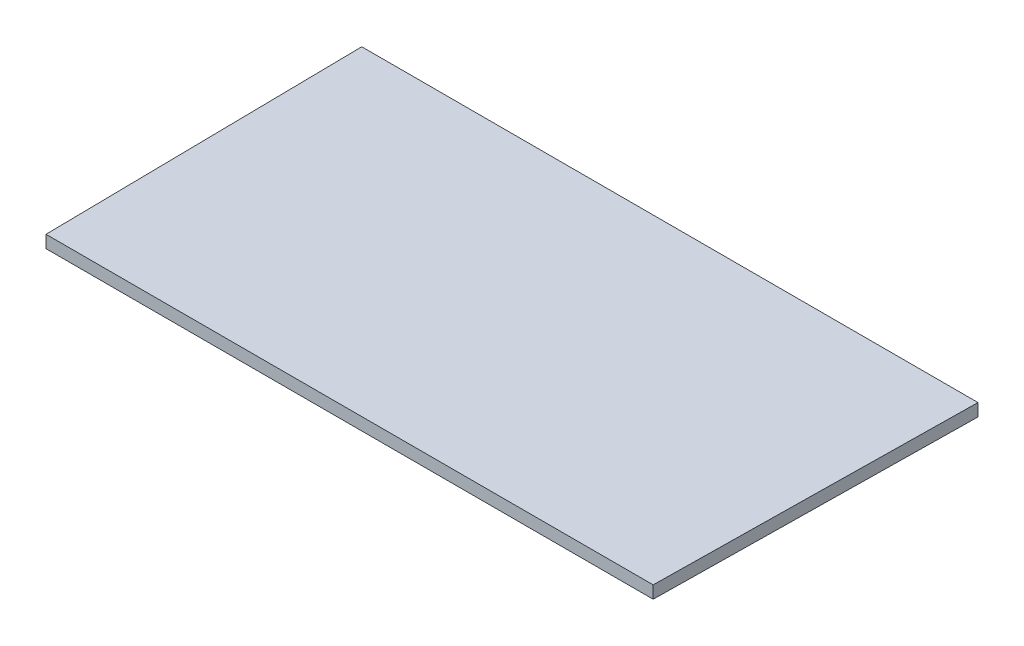
ISO-10303-21;
HEADER;
FILE_DESCRIPTION(('STEP AP214'),'2;1');
FILE_NAME('part.step','',(''),(''),'','','');
FILE_SCHEMA(('AUTOMOTIVE_DESIGN { 1 0 10303 214 1 1 1 1 }'));
ENDSEC;
DATA;
#1=APPLICATION_CONTEXT('core data for automotive mechanical design processes');
#2=APPLICATION_PROTOCOL_DEFINITION('international standard','automotive_design',2000,#1);
#3=PRODUCT_CONTEXT('',#1,'mechanical');
#4=PRODUCT('Part','Part','',(#3));
#5=PRODUCT_RELATED_PRODUCT_CATEGORY('part','',(#4));
#6=PRODUCT_DEFINITION_FORMATION('','',#4);
#7=PRODUCT_DEFINITION_CONTEXT('part definition',#1,'design');
#8=PRODUCT_DEFINITION('design','',#6,#7);
#9=PRODUCT_DEFINITION_SHAPE('','',#8);
#10=(LENGTH_UNIT() NAMED_UNIT(*) SI_UNIT(.MILLI.,.METRE.));
#11=(NAMED_UNIT(*) PLANE_ANGLE_UNIT() SI_UNIT($,.RADIAN.));
#12=(NAMED_UNIT(*) SI_UNIT($,.STERADIAN.) SOLID_ANGLE_UNIT());
#13=UNCERTAINTY_MEASURE_WITH_UNIT(LENGTH_MEASURE(1.E-05),#10,'distance_accuracy_value','');
#14=(GEOMETRIC_REPRESENTATION_CONTEXT(3) GLOBAL_UNCERTAINTY_ASSIGNED_CONTEXT((#13)) GLOBAL_UNIT_ASSIGNED_CONTEXT((#10,
#11,#12)) REPRESENTATION_CONTEXT('',''));
#15=CARTESIAN_POINT('',(0.,0.,0.));
#16=DIRECTION('',(0.,0.,1.));
#17=DIRECTION('',(1.,0.,0.));
#18=AXIS2_PLACEMENT_3D('',#15,#16,#17);
#19=CARTESIAN_POINT('',(74.075,3.,-77.));
#20=DIRECTION('',(-0.999900071919753,0.,-0.0141366960380366));
#21=DIRECTION('',(-0.0141366960380366,0.,0.999900071919754));
#22=AXIS2_PLACEMENT_3D('',#19,#20,#21);
#23=PLANE('',#22);
#24=DIRECTION('',(0.0141366960380366,0.,-0.999900071919753));
#25=VECTOR('',#24,1.);
#26=CARTESIAN_POINT('',(74.075,0.,-77.));
#27=LINE('',#26,#25);
#28=CARTESIAN_POINT('',(72.9863656199275,0.,0.));
#29=VERTEX_POINT('',#28);
#30=CARTESIAN_POINT('',(74.075,0.,-77.));
#31=VERTEX_POINT('',#30);
#32=EDGE_CURVE('E100',#29,#31,#27,.T.);
#33=ORIENTED_EDGE('',*,*,#32,.T.);
#34=DIRECTION('',(0.,-1.,0.));
#35=VECTOR('',#34,1.);
#36=CARTESIAN_POINT('',(74.075,3.,-77.));
#37=LINE('',#36,#35);
#38=CARTESIAN_POINT('',(74.075,3.,-77.));
#39=VERTEX_POINT('',#38);
#40=EDGE_CURVE('E11',#39,#31,#37,.T.);
#41=ORIENTED_EDGE('',*,*,#40,.F.);
#42=DIRECTION('',(0.0141366960380366,0.,-0.999900071919753));
#43=VECTOR('',#42,1.);
#44=CARTESIAN_POINT('',(74.075,3.,-77.));
#45=LINE('',#44,#43);
#46=CARTESIAN_POINT('',(72.9863656199275,3.,0.));
#47=VERTEX_POINT('',#46);
#48=EDGE_CURVE('E88',#47,#39,#45,.T.);
#49=ORIENTED_EDGE('',*,*,#48,.F.);
#50=DIRECTION('',(0.,-1.,0.));
#51=VECTOR('',#50,1.);
#52=CARTESIAN_POINT('',(72.9863656199275,3.,0.));
#53=LINE('',#52,#51);
#54=EDGE_CURVE('E96',#47,#29,#53,.T.);
#55=ORIENTED_EDGE('',*,*,#54,.T.);
#56=EDGE_LOOP('',(#33,#41,#49,#55));
#57=FACE_BOUND('',#56,.T.);
#58=ADVANCED_FACE('F37',(#57),#23,.F.);
#59=CARTESIAN_POINT('',(-74.075,3.,-77.));
#60=DIRECTION('',(0.,0.,1.));
#61=DIRECTION('',(1.,0.,0.));
#62=AXIS2_PLACEMENT_3D('',#59,#60,#61);
#63=PLANE('',#62);
#64=DIRECTION('',(-1.,0.,0.));
#65=VECTOR('',#64,1.);
#66=CARTESIAN_POINT('',(-74.075,0.,-77.));
#67=LINE('',#66,#65);
#68=CARTESIAN_POINT('',(-74.075,0.,-77.));
#69=VERTEX_POINT('',#68);
#70=EDGE_CURVE('E92',#31,#69,#67,.T.);
#71=ORIENTED_EDGE('',*,*,#70,.T.);
#72=DIRECTION('',(0.,-1.,0.));
#73=VECTOR('',#72,1.);
#74=CARTESIAN_POINT('',(-74.075,3.,-77.));
#75=LINE('',#74,#73);
#76=CARTESIAN_POINT('',(-74.075,3.,-77.));
#77=VERTEX_POINT('',#76);
#78=EDGE_CURVE('E45',#77,#69,#75,.T.);
#79=ORIENTED_EDGE('',*,*,#78,.F.);
#80=DIRECTION('',(-1.,0.,0.));
#81=VECTOR('',#80,1.);
#82=CARTESIAN_POINT('',(-74.075,3.,-77.));
#83=LINE('',#82,#81);
#84=EDGE_CURVE('E83',#39,#77,#83,.T.);
#85=ORIENTED_EDGE('',*,*,#84,.F.);
#86=ORIENTED_EDGE('',*,*,#40,.T.);
#87=EDGE_LOOP('',(#71,#79,#85,#86));
#88=FACE_BOUND('',#87,.T.);
#89=ADVANCED_FACE('F91',(#88),#63,.F.);
#90=CARTESIAN_POINT('',(-72.9863656199275,3.,0.));
#91=DIRECTION('',(0.999900071919754,0.,-0.0141366960380362));
#92=DIRECTION('',(-0.0141366960380362,0.,-0.999900071919754));
#93=AXIS2_PLACEMENT_3D('',#90,#91,#92);
#94=PLANE('',#93);
#95=DIRECTION('',(0.0141366960380362,0.,0.999900071919753));
#96=VECTOR('',#95,1.);
#97=CARTESIAN_POINT('',(-72.9863656199275,0.,0.));
#98=LINE('',#97,#96);
#99=CARTESIAN_POINT('',(-72.9863656199275,0.,0.));
#100=VERTEX_POINT('',#99);
#101=EDGE_CURVE('E70',#69,#100,#98,.T.);
#102=ORIENTED_EDGE('',*,*,#101,.T.);
#103=DIRECTION('',(0.,-1.,0.));
#104=VECTOR('',#103,1.);
#105=CARTESIAN_POINT('',(-72.9863656199275,3.,0.));
#106=LINE('',#105,#104);
#107=CARTESIAN_POINT('',(-72.9863656199275,3.,0.));
#108=VERTEX_POINT('',#107);
#109=EDGE_CURVE('E93',#108,#100,#106,.T.);
#110=ORIENTED_EDGE('',*,*,#109,.F.);
#111=DIRECTION('',(0.0141366960380362,0.,0.999900071919753));
#112=VECTOR('',#111,1.);
#113=CARTESIAN_POINT('',(-72.9863656199275,3.,0.));
#114=LINE('',#113,#112);
#115=EDGE_CURVE('E86',#77,#108,#114,.T.);
#116=ORIENTED_EDGE('',*,*,#115,.F.);
#117=ORIENTED_EDGE('',*,*,#78,.T.);
#118=EDGE_LOOP('',(#102,#110,#116,#117));
#119=FACE_BOUND('',#118,.T.);
#120=ADVANCED_FACE('F94',(#119),#94,.F.);
#121=CARTESIAN_POINT('',(-72.9863656199275,3.,0.));
#122=DIRECTION('',(0.,0.,-1.));
#123=DIRECTION('',(-1.,0.,0.));
#124=AXIS2_PLACEMENT_3D('',#121,#122,#123);
#125=PLANE('',#124);
#126=DIRECTION('',(1.,0.,0.));
#127=VECTOR('',#126,1.);
#128=CARTESIAN_POINT('',(-72.9863656199275,0.,0.));
#129=LINE('',#128,#127);
#130=EDGE_CURVE('E76',#100,#29,#129,.T.);
#131=ORIENTED_EDGE('',*,*,#130,.T.);
#132=ORIENTED_EDGE('',*,*,#54,.F.);
#133=DIRECTION('',(1.,0.,0.));
#134=VECTOR('',#133,1.);
#135=CARTESIAN_POINT('',(-72.9863656199275,3.,0.));
#136=LINE('',#135,#134);
#137=EDGE_CURVE('E53',#108,#47,#136,.T.);
#138=ORIENTED_EDGE('',*,*,#137,.F.);
#139=ORIENTED_EDGE('',*,*,#109,.T.);
#140=EDGE_LOOP('',(#131,#132,#138,#139));
#141=FACE_BOUND('',#140,.T.);
#142=ADVANCED_FACE('F107',(#141),#125,.F.);
#143=CARTESIAN_POINT('',(0.,3.,0.));
#144=DIRECTION('',(0.,1.,0.));
#145=DIRECTION('',(0.,0.,1.));
#146=AXIS2_PLACEMENT_3D('',#143,#144,#145);
#147=PLANE('',#146);
#148=ORIENTED_EDGE('',*,*,#48,.T.);
#149=ORIENTED_EDGE('',*,*,#84,.T.);
#150=ORIENTED_EDGE('',*,*,#115,.T.);
#151=ORIENTED_EDGE('',*,*,#137,.T.);
#152=EDGE_LOOP('',(#148,#149,#150,#151));
#153=FACE_BOUND('',#152,.T.);
#154=ADVANCED_FACE('F84',(#153),#147,.T.);
#155=CARTESIAN_POINT('',(0.,0.,0.));
#156=DIRECTION('',(0.,1.,0.));
#157=DIRECTION('',(0.,0.,1.));
#158=AXIS2_PLACEMENT_3D('',#155,#156,#157);
#159=PLANE('',#158);
#160=ORIENTED_EDGE('',*,*,#32,.F.);
#161=ORIENTED_EDGE('',*,*,#130,.F.);
#162=ORIENTED_EDGE('',*,*,#101,.F.);
#163=ORIENTED_EDGE('',*,*,#70,.F.);
#164=EDGE_LOOP('',(#160,#161,#162,#163));
#165=FACE_BOUND('',#164,.T.);
#166=ADVANCED_FACE('F110',(#165),#159,.F.);
#167=CLOSED_SHELL('',(#58,#89,#120,#142,#154,#166));
#168=MANIFOLD_SOLID_BREP('B2',#167);
#169=ADVANCED_BREP_SHAPE_REPRESENTATION('',(#18,#168),#14);
#170=SHAPE_DEFINITION_REPRESENTATION(#9,#169);
ENDSEC;
END-ISO-10303-21;
